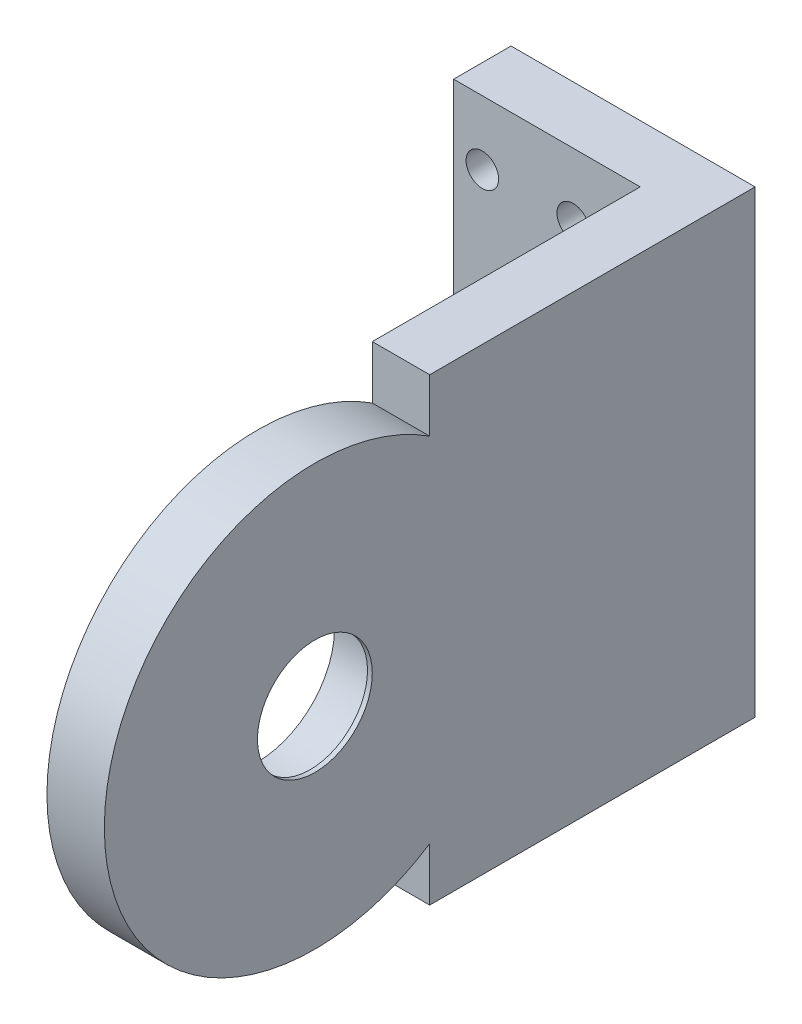
ISO-10303-21;
HEADER;
FILE_DESCRIPTION(('STEP AP214'),'2;1');
FILE_NAME('part.step','',(''),(''),'','','');
FILE_SCHEMA(('AUTOMOTIVE_DESIGN { 1 0 10303 214 1 1 1 1 }'));
ENDSEC;
DATA;
#1=APPLICATION_CONTEXT('core data for automotive mechanical design processes');
#2=APPLICATION_PROTOCOL_DEFINITION('international standard','automotive_design',2000,#1);
#3=PRODUCT_CONTEXT('',#1,'mechanical');
#4=PRODUCT('Part','Part','',(#3));
#5=PRODUCT_RELATED_PRODUCT_CATEGORY('part','',(#4));
#6=PRODUCT_DEFINITION_FORMATION('','',#4);
#7=PRODUCT_DEFINITION_CONTEXT('part definition',#1,'design');
#8=PRODUCT_DEFINITION('design','',#6,#7);
#9=PRODUCT_DEFINITION_SHAPE('','',#8);
#10=(LENGTH_UNIT() NAMED_UNIT(*) SI_UNIT(.MILLI.,.METRE.));
#11=(NAMED_UNIT(*) PLANE_ANGLE_UNIT() SI_UNIT($,.RADIAN.));
#12=(NAMED_UNIT(*) SI_UNIT($,.STERADIAN.) SOLID_ANGLE_UNIT());
#13=UNCERTAINTY_MEASURE_WITH_UNIT(LENGTH_MEASURE(1.E-05),#10,'distance_accuracy_value','');
#14=(GEOMETRIC_REPRESENTATION_CONTEXT(3) GLOBAL_UNCERTAINTY_ASSIGNED_CONTEXT((#13)) GLOBAL_UNIT_ASSIGNED_CONTEXT((#10,
#11,#12)) REPRESENTATION_CONTEXT('',''));
#15=CARTESIAN_POINT('',(0.,0.,0.));
#16=DIRECTION('',(0.,0.,1.));
#17=DIRECTION('',(1.,0.,0.));
#18=AXIS2_PLACEMENT_3D('',#15,#16,#17);
#19=CARTESIAN_POINT('',(342.5,300.,300.));
#20=DIRECTION('',(-1.,0.,0.));
#21=DIRECTION('',(0.,0.,1.));
#22=AXIS2_PLACEMENT_3D('',#19,#20,#21);
#23=CYLINDRICAL_SURFACE('',#22,22.);
#24=DIRECTION('',(-1.,0.,0.));
#25=VECTOR('',#24,1.);
#26=CARTESIAN_POINT('',(342.5,281.560911085414,288.));
#27=LINE('',#26,#25);
#28=CARTESIAN_POINT('',(342.5,281.560911085414,288.));
#29=VERTEX_POINT('',#28);
#30=CARTESIAN_POINT('',(336.5,281.560911085414,288.));
#31=VERTEX_POINT('',#30);
#32=EDGE_CURVE('E63',#29,#31,#27,.T.);
#33=ORIENTED_EDGE('',*,*,#32,.F.);
#34=CARTESIAN_POINT('',(342.5,300.,300.));
#35=DIRECTION('',(1.,0.,0.));
#36=DIRECTION('',(0.,0.,-1.));
#37=AXIS2_PLACEMENT_3D('',#34,#35,#36);
#38=CIRCLE('',#37,22.);
#39=CARTESIAN_POINT('',(342.5,318.439088914586,288.));
#40=VERTEX_POINT('',#39);
#41=EDGE_CURVE('E11',#40,#29,#38,.T.);
#42=ORIENTED_EDGE('',*,*,#41,.F.);
#43=DIRECTION('',(-1.,0.,0.));
#44=VECTOR('',#43,1.);
#45=CARTESIAN_POINT('',(342.5,318.439088914586,288.));
#46=LINE('',#45,#44);
#47=CARTESIAN_POINT('',(336.5,318.439088914586,288.));
#48=VERTEX_POINT('',#47);
#49=EDGE_CURVE('E169',#48,#40,#46,.F.);
#50=ORIENTED_EDGE('',*,*,#49,.F.);
#51=CARTESIAN_POINT('',(336.5,300.,300.));
#52=DIRECTION('',(1.,0.,0.));
#53=DIRECTION('',(0.,0.,-1.));
#54=AXIS2_PLACEMENT_3D('',#51,#52,#53);
#55=CIRCLE('',#54,22.);
#56=EDGE_CURVE('E47',#48,#31,#55,.T.);
#57=ORIENTED_EDGE('',*,*,#56,.T.);
#58=EDGE_LOOP('',(#33,#42,#50,#57));
#59=FACE_BOUND('',#58,.T.);
#60=ADVANCED_FACE('F39',(#59),#23,.T.);
#61=CARTESIAN_POINT('',(342.5,300.,300.));
#62=DIRECTION('',(1.,0.,0.));
#63=DIRECTION('',(0.,0.,-1.));
#64=AXIS2_PLACEMENT_3D('',#61,#62,#63);
#65=PLANE('',#64);
#66=CARTESIAN_POINT('',(342.5,300.,300.));
#67=DIRECTION('',(1.,0.,0.));
#68=DIRECTION('',(0.,0.,-1.));
#69=AXIS2_PLACEMENT_3D('',#66,#67,#68);
#70=CIRCLE('',#69,6.00000000000001);
#71=CARTESIAN_POINT('',(342.5,300.,294.));
#72=VERTEX_POINT('',#71);
#73=EDGE_CURVE('E139',#72,#72,#70,.T.);
#74=ORIENTED_EDGE('',*,*,#73,.F.);
#75=EDGE_LOOP('',(#74));
#76=FACE_BOUND('',#75,.T.);
#77=ORIENTED_EDGE('',*,*,#41,.T.);
#78=DIRECTION('',(0.,-1.,0.));
#79=VECTOR('',#78,1.);
#80=CARTESIAN_POINT('',(342.5,276.,288.));
#81=LINE('',#80,#79);
#82=CARTESIAN_POINT('',(342.5,276.,288.));
#83=VERTEX_POINT('',#82);
#84=EDGE_CURVE('E148',#29,#83,#81,.T.);
#85=ORIENTED_EDGE('',*,*,#84,.T.);
#86=DIRECTION('',(0.,0.,-1.));
#87=VECTOR('',#86,1.);
#88=CARTESIAN_POINT('',(342.5,276.,254.));
#89=LINE('',#88,#87);
#90=CARTESIAN_POINT('',(342.5,276.,254.));
#91=VERTEX_POINT('',#90);
#92=EDGE_CURVE('E152',#83,#91,#89,.T.);
#93=ORIENTED_EDGE('',*,*,#92,.T.);
#94=DIRECTION('',(0.,1.,0.));
#95=VECTOR('',#94,1.);
#96=CARTESIAN_POINT('',(342.5,324.,254.));
#97=LINE('',#96,#95);
#98=CARTESIAN_POINT('',(342.5,324.,254.));
#99=VERTEX_POINT('',#98);
#100=EDGE_CURVE('E143',#91,#99,#97,.T.);
#101=ORIENTED_EDGE('',*,*,#100,.T.);
#102=DIRECTION('',(0.,0.,1.));
#103=VECTOR('',#102,1.);
#104=CARTESIAN_POINT('',(342.5,324.,288.));
#105=LINE('',#104,#103);
#106=CARTESIAN_POINT('',(342.5,324.,288.));
#107=VERTEX_POINT('',#106);
#108=EDGE_CURVE('E146',#99,#107,#105,.T.);
#109=ORIENTED_EDGE('',*,*,#108,.T.);
#110=EDGE_CURVE('E149',#107,#40,#81,.T.);
#111=ORIENTED_EDGE('',*,*,#110,.T.);
#112=EDGE_LOOP('',(#77,#85,#93,#101,#109,#111));
#113=FACE_BOUND('',#112,.T.);
#114=ADVANCED_FACE('F188',(#76,#113),#65,.T.);
#115=CARTESIAN_POINT('',(336.5,300.,300.));
#116=DIRECTION('',(1.,0.,0.));
#117=DIRECTION('',(0.,0.,-1.));
#118=AXIS2_PLACEMENT_3D('',#115,#116,#117);
#119=PLANE('',#118);
#120=CARTESIAN_POINT('',(336.5,300.,300.));
#121=DIRECTION('',(1.,0.,0.));
#122=DIRECTION('',(0.,0.,-1.));
#123=AXIS2_PLACEMENT_3D('',#120,#121,#122);
#124=CIRCLE('',#123,8.05);
#125=CARTESIAN_POINT('',(336.5,300.,291.95));
#126=VERTEX_POINT('',#125);
#127=EDGE_CURVE('E129',#126,#126,#124,.T.);
#128=ORIENTED_EDGE('',*,*,#127,.T.);
#129=EDGE_LOOP('',(#128));
#130=FACE_BOUND('',#129,.T.);
#131=DIRECTION('',(0.,0.,1.));
#132=VECTOR('',#131,1.);
#133=CARTESIAN_POINT('',(336.5,324.,288.));
#134=LINE('',#133,#132);
#135=CARTESIAN_POINT('',(336.5,324.,260.));
#136=VERTEX_POINT('',#135);
#137=CARTESIAN_POINT('',(336.5,324.,288.));
#138=VERTEX_POINT('',#137);
#139=EDGE_CURVE('E142',#136,#138,#134,.T.);
#140=ORIENTED_EDGE('',*,*,#139,.F.);
#141=DIRECTION('',(0.,-1.,0.));
#142=VECTOR('',#141,1.);
#143=CARTESIAN_POINT('',(336.5,300.,260.));
#144=LINE('',#143,#142);
#145=CARTESIAN_POINT('',(336.5,276.,260.));
#146=VERTEX_POINT('',#145);
#147=EDGE_CURVE('E126',#136,#146,#144,.T.);
#148=ORIENTED_EDGE('',*,*,#147,.T.);
#149=DIRECTION('',(0.,0.,-1.));
#150=VECTOR('',#149,1.);
#151=CARTESIAN_POINT('',(336.5,276.,254.));
#152=LINE('',#151,#150);
#153=CARTESIAN_POINT('',(336.5,276.,288.));
#154=VERTEX_POINT('',#153);
#155=EDGE_CURVE('E113',#154,#146,#152,.T.);
#156=ORIENTED_EDGE('',*,*,#155,.F.);
#157=DIRECTION('',(0.,-1.,0.));
#158=VECTOR('',#157,1.);
#159=CARTESIAN_POINT('',(336.5,276.,288.));
#160=LINE('',#159,#158);
#161=EDGE_CURVE('E156',#31,#154,#160,.T.);
#162=ORIENTED_EDGE('',*,*,#161,.F.);
#163=ORIENTED_EDGE('',*,*,#56,.F.);
#164=EDGE_CURVE('E157',#138,#48,#160,.T.);
#165=ORIENTED_EDGE('',*,*,#164,.F.);
#166=EDGE_LOOP('',(#140,#148,#156,#162,#163,#165));
#167=FACE_BOUND('',#166,.T.);
#168=ADVANCED_FACE('F181',(#130,#167),#119,.F.);
#169=CARTESIAN_POINT('',(342.5,276.,288.));
#170=DIRECTION('',(0.,0.,-1.));
#171=DIRECTION('',(-1.,0.,0.));
#172=AXIS2_PLACEMENT_3D('',#169,#170,#171);
#173=PLANE('',#172);
#174=ORIENTED_EDGE('',*,*,#84,.F.);
#175=ORIENTED_EDGE('',*,*,#32,.T.);
#176=ORIENTED_EDGE('',*,*,#161,.T.);
#177=DIRECTION('',(-1.,0.,0.));
#178=VECTOR('',#177,1.);
#179=CARTESIAN_POINT('',(342.5,276.,288.));
#180=LINE('',#179,#178);
#181=EDGE_CURVE('E162',#83,#154,#180,.T.);
#182=ORIENTED_EDGE('',*,*,#181,.F.);
#183=EDGE_LOOP('',(#174,#175,#176,#182));
#184=FACE_BOUND('',#183,.T.);
#185=ADVANCED_FACE('F178',(#184),#173,.F.);
#186=ORIENTED_EDGE('',*,*,#164,.T.);
#187=ORIENTED_EDGE('',*,*,#49,.T.);
#188=ORIENTED_EDGE('',*,*,#110,.F.);
#189=DIRECTION('',(-1.,0.,0.));
#190=VECTOR('',#189,1.);
#191=CARTESIAN_POINT('',(342.5,324.,288.));
#192=LINE('',#191,#190);
#193=EDGE_CURVE('E164',#107,#138,#192,.T.);
#194=ORIENTED_EDGE('',*,*,#193,.T.);
#195=EDGE_LOOP('',(#186,#187,#188,#194));
#196=FACE_BOUND('',#195,.T.);
#197=ADVANCED_FACE('F186',(#196),#173,.F.);
#198=CARTESIAN_POINT('',(342.5,324.,254.));
#199=DIRECTION('',(0.,0.,1.));
#200=DIRECTION('',(1.,0.,0.));
#201=AXIS2_PLACEMENT_3D('',#198,#199,#200);
#202=PLANE('',#201);
#203=DIRECTION('',(0.,-1.,0.));
#204=VECTOR('',#203,1.);
#205=CARTESIAN_POINT('',(317.,324.,254.));
#206=LINE('',#205,#204);
#207=CARTESIAN_POINT('',(317.,324.,254.));
#208=VERTEX_POINT('',#207);
#209=CARTESIAN_POINT('',(317.,276.,254.));
#210=VERTEX_POINT('',#209);
#211=EDGE_CURVE('E122',#208,#210,#206,.T.);
#212=ORIENTED_EDGE('',*,*,#211,.F.);
#213=DIRECTION('',(-1.,0.,0.));
#214=VECTOR('',#213,1.);
#215=CARTESIAN_POINT('',(342.5,324.,254.));
#216=LINE('',#215,#214);
#217=EDGE_CURVE('E167',#99,#208,#216,.T.);
#218=ORIENTED_EDGE('',*,*,#217,.F.);
#219=ORIENTED_EDGE('',*,*,#100,.F.);
#220=DIRECTION('',(-1.,0.,0.));
#221=VECTOR('',#220,1.);
#222=CARTESIAN_POINT('',(342.5,276.,254.));
#223=LINE('',#222,#221);
#224=EDGE_CURVE('E154',#91,#210,#223,.T.);
#225=ORIENTED_EDGE('',*,*,#224,.T.);
#226=EDGE_LOOP('',(#212,#218,#219,#225));
#227=FACE_BOUND('',#226,.T.);
#228=CARTESIAN_POINT('',(320.,282.7,254.));
#229=DIRECTION('',(0.,0.,1.));
#230=DIRECTION('',(1.,0.,0.));
#231=AXIS2_PLACEMENT_3D('',#228,#229,#230);
#232=CIRCLE('',#231,1.69999999999998);
#233=CARTESIAN_POINT('',(321.7,282.7,254.));
#234=VERTEX_POINT('',#233);
#235=EDGE_CURVE('E196',#234,#234,#232,.T.);
#236=ORIENTED_EDGE('',*,*,#235,.T.);
#237=EDGE_LOOP('',(#236));
#238=FACE_BOUND('',#237,.T.);
#239=CARTESIAN_POINT('',(320.,317.3,254.));
#240=DIRECTION('',(0.,0.,1.));
#241=DIRECTION('',(1.,0.,0.));
#242=AXIS2_PLACEMENT_3D('',#239,#240,#241);
#243=CIRCLE('',#242,1.69999999999998);
#244=CARTESIAN_POINT('',(321.7,317.3,254.));
#245=VERTEX_POINT('',#244);
#246=EDGE_CURVE('E203',#245,#245,#243,.T.);
#247=ORIENTED_EDGE('',*,*,#246,.T.);
#248=EDGE_LOOP('',(#247));
#249=FACE_BOUND('',#248,.T.);
#250=CARTESIAN_POINT('',(329.5,282.7,254.));
#251=DIRECTION('',(0.,0.,1.));
#252=DIRECTION('',(1.,0.,0.));
#253=AXIS2_PLACEMENT_3D('',#250,#251,#252);
#254=CIRCLE('',#253,1.69999999999998);
#255=CARTESIAN_POINT('',(331.2,282.7,254.));
#256=VERTEX_POINT('',#255);
#257=EDGE_CURVE('E209',#256,#256,#254,.T.);
#258=ORIENTED_EDGE('',*,*,#257,.T.);
#259=EDGE_LOOP('',(#258));
#260=FACE_BOUND('',#259,.T.);
#261=CARTESIAN_POINT('',(329.5,317.3,254.));
#262=DIRECTION('',(0.,0.,1.));
#263=DIRECTION('',(1.,0.,0.));
#264=AXIS2_PLACEMENT_3D('',#261,#262,#263);
#265=CIRCLE('',#264,1.69999999999998);
#266=CARTESIAN_POINT('',(331.2,317.3,254.));
#267=VERTEX_POINT('',#266);
#268=EDGE_CURVE('E215',#267,#267,#265,.T.);
#269=ORIENTED_EDGE('',*,*,#268,.T.);
#270=EDGE_LOOP('',(#269));
#271=FACE_BOUND('',#270,.T.);
#272=ADVANCED_FACE('F192',(#227,#238,#249,#260,#271),#202,.F.);
#273=CARTESIAN_POINT('',(342.5,324.,288.));
#274=DIRECTION('',(0.,-1.,0.));
#275=DIRECTION('',(0.,0.,-1.));
#276=AXIS2_PLACEMENT_3D('',#273,#274,#275);
#277=PLANE('',#276);
#278=ORIENTED_EDGE('',*,*,#217,.T.);
#279=DIRECTION('',(0.,0.,-1.));
#280=VECTOR('',#279,1.);
#281=CARTESIAN_POINT('',(317.,324.,260.));
#282=LINE('',#281,#280);
#283=CARTESIAN_POINT('',(317.,324.,260.));
#284=VERTEX_POINT('',#283);
#285=EDGE_CURVE('E127',#284,#208,#282,.T.);
#286=ORIENTED_EDGE('',*,*,#285,.F.);
#287=DIRECTION('',(-1.,0.,0.));
#288=VECTOR('',#287,1.);
#289=CARTESIAN_POINT('',(336.51,324.,260.));
#290=LINE('',#289,#288);
#291=EDGE_CURVE('E55',#136,#284,#290,.T.);
#292=ORIENTED_EDGE('',*,*,#291,.F.);
#293=ORIENTED_EDGE('',*,*,#139,.T.);
#294=ORIENTED_EDGE('',*,*,#193,.F.);
#295=ORIENTED_EDGE('',*,*,#108,.F.);
#296=EDGE_LOOP('',(#278,#286,#292,#293,#294,#295));
#297=FACE_BOUND('',#296,.T.);
#298=ADVANCED_FACE('F183',(#297),#277,.F.);
#299=CARTESIAN_POINT('',(342.5,276.,254.));
#300=DIRECTION('',(0.,1.,0.));
#301=DIRECTION('',(0.,0.,1.));
#302=AXIS2_PLACEMENT_3D('',#299,#300,#301);
#303=PLANE('',#302);
#304=ORIENTED_EDGE('',*,*,#155,.T.);
#305=DIRECTION('',(1.,0.,0.));
#306=VECTOR('',#305,1.);
#307=CARTESIAN_POINT('',(317.,276.,260.));
#308=LINE('',#307,#306);
#309=CARTESIAN_POINT('',(317.,276.,260.));
#310=VERTEX_POINT('',#309);
#311=EDGE_CURVE('E104',#310,#146,#308,.T.);
#312=ORIENTED_EDGE('',*,*,#311,.F.);
#313=DIRECTION('',(0.,0.,-1.));
#314=VECTOR('',#313,1.);
#315=CARTESIAN_POINT('',(317.,276.,260.));
#316=LINE('',#315,#314);
#317=EDGE_CURVE('E109',#310,#210,#316,.T.);
#318=ORIENTED_EDGE('',*,*,#317,.T.);
#319=ORIENTED_EDGE('',*,*,#224,.F.);
#320=ORIENTED_EDGE('',*,*,#92,.F.);
#321=ORIENTED_EDGE('',*,*,#181,.T.);
#322=EDGE_LOOP('',(#304,#312,#318,#319,#320,#321));
#323=FACE_BOUND('',#322,.T.);
#324=ADVANCED_FACE('F106',(#323),#303,.F.);
#325=CARTESIAN_POINT('',(342.5,300.,300.));
#326=DIRECTION('',(-1.,0.,0.));
#327=DIRECTION('',(0.,0.,1.));
#328=AXIS2_PLACEMENT_3D('',#325,#326,#327);
#329=CYLINDRICAL_SURFACE('',#328,6.00000000000001);
#330=CARTESIAN_POINT('',(342.,300.,300.));
#331=DIRECTION('',(1.,0.,0.));
#332=DIRECTION('',(0.,0.,-1.));
#333=AXIS2_PLACEMENT_3D('',#330,#331,#332);
#334=CIRCLE('',#333,6.00000000000001);
#335=CARTESIAN_POINT('',(342.,300.,294.));
#336=VERTEX_POINT('',#335);
#337=EDGE_CURVE('E42',#336,#336,#334,.T.);
#338=ORIENTED_EDGE('',*,*,#337,.F.);
#339=EDGE_LOOP('',(#338));
#340=FACE_BOUND('',#339,.T.);
#341=ORIENTED_EDGE('',*,*,#73,.T.);
#342=EDGE_LOOP('',(#341));
#343=FACE_BOUND('',#342,.T.);
#344=ADVANCED_FACE('F269',(#340,#343),#329,.F.);
#345=CARTESIAN_POINT('',(342.,300.,300.));
#346=DIRECTION('',(-1.,0.,0.));
#347=DIRECTION('',(0.,0.,1.));
#348=AXIS2_PLACEMENT_3D('',#345,#346,#347);
#349=CYLINDRICAL_SURFACE('',#348,8.05);
#350=CARTESIAN_POINT('',(342.,300.,300.));
#351=DIRECTION('',(1.,0.,0.));
#352=DIRECTION('',(0.,0.,-1.));
#353=AXIS2_PLACEMENT_3D('',#350,#351,#352);
#354=CIRCLE('',#353,8.05);
#355=CARTESIAN_POINT('',(342.,300.,291.95));
#356=VERTEX_POINT('',#355);
#357=EDGE_CURVE('E134',#356,#356,#354,.T.);
#358=ORIENTED_EDGE('',*,*,#357,.T.);
#359=EDGE_LOOP('',(#358));
#360=FACE_BOUND('',#359,.T.);
#361=ORIENTED_EDGE('',*,*,#127,.F.);
#362=EDGE_LOOP('',(#361));
#363=FACE_BOUND('',#362,.T.);
#364=ADVANCED_FACE('F271',(#360,#363),#349,.F.);
#365=CARTESIAN_POINT('',(342.,300.,300.));
#366=DIRECTION('',(1.,0.,0.));
#367=DIRECTION('',(0.,0.,-1.));
#368=AXIS2_PLACEMENT_3D('',#365,#366,#367);
#369=PLANE('',#368);
#370=ORIENTED_EDGE('',*,*,#337,.T.);
#371=EDGE_LOOP('',(#370));
#372=FACE_BOUND('',#371,.T.);
#373=ORIENTED_EDGE('',*,*,#357,.F.);
#374=EDGE_LOOP('',(#373));
#375=FACE_BOUND('',#374,.T.);
#376=ADVANCED_FACE('F226',(#372,#375),#369,.F.);
#377=CARTESIAN_POINT('',(0.,0.,260.));
#378=DIRECTION('',(0.,0.,1.));
#379=DIRECTION('',(1.,0.,0.));
#380=AXIS2_PLACEMENT_3D('',#377,#378,#379);
#381=PLANE('',#380);
#382=CARTESIAN_POINT('',(329.5,317.3,260.));
#383=DIRECTION('',(0.,0.,1.));
#384=DIRECTION('',(1.,0.,0.));
#385=AXIS2_PLACEMENT_3D('',#382,#383,#384);
#386=CIRCLE('',#385,1.69999999999998);
#387=CARTESIAN_POINT('',(331.2,317.3,260.));
#388=VERTEX_POINT('',#387);
#389=EDGE_CURVE('E212',#388,#388,#386,.T.);
#390=ORIENTED_EDGE('',*,*,#389,.F.);
#391=EDGE_LOOP('',(#390));
#392=FACE_BOUND('',#391,.T.);
#393=CARTESIAN_POINT('',(320.,317.3,260.));
#394=DIRECTION('',(0.,0.,1.));
#395=DIRECTION('',(1.,0.,0.));
#396=AXIS2_PLACEMENT_3D('',#393,#394,#395);
#397=CIRCLE('',#396,1.69999999999998);
#398=CARTESIAN_POINT('',(321.7,317.3,260.));
#399=VERTEX_POINT('',#398);
#400=EDGE_CURVE('E201',#399,#399,#397,.T.);
#401=ORIENTED_EDGE('',*,*,#400,.F.);
#402=EDGE_LOOP('',(#401));
#403=FACE_BOUND('',#402,.T.);
#404=CARTESIAN_POINT('',(320.,282.7,260.));
#405=DIRECTION('',(0.,0.,1.));
#406=DIRECTION('',(1.,0.,0.));
#407=AXIS2_PLACEMENT_3D('',#404,#405,#406);
#408=CIRCLE('',#407,1.69999999999998);
#409=CARTESIAN_POINT('',(321.7,282.7,260.));
#410=VERTEX_POINT('',#409);
#411=EDGE_CURVE('E194',#410,#410,#408,.T.);
#412=ORIENTED_EDGE('',*,*,#411,.F.);
#413=EDGE_LOOP('',(#412));
#414=FACE_BOUND('',#413,.T.);
#415=CARTESIAN_POINT('',(329.5,282.7,260.));
#416=DIRECTION('',(0.,0.,1.));
#417=DIRECTION('',(1.,0.,0.));
#418=AXIS2_PLACEMENT_3D('',#415,#416,#417);
#419=CIRCLE('',#418,1.69999999999998);
#420=CARTESIAN_POINT('',(331.2,282.7,260.));
#421=VERTEX_POINT('',#420);
#422=EDGE_CURVE('E206',#421,#421,#419,.T.);
#423=ORIENTED_EDGE('',*,*,#422,.F.);
#424=EDGE_LOOP('',(#423));
#425=FACE_BOUND('',#424,.T.);
#426=ORIENTED_EDGE('',*,*,#147,.F.);
#427=ORIENTED_EDGE('',*,*,#291,.T.);
#428=DIRECTION('',(0.,-1.,0.));
#429=VECTOR('',#428,1.);
#430=CARTESIAN_POINT('',(317.,324.,260.));
#431=LINE('',#430,#429);
#432=EDGE_CURVE('E116',#284,#310,#431,.T.);
#433=ORIENTED_EDGE('',*,*,#432,.T.);
#434=ORIENTED_EDGE('',*,*,#311,.T.);
#435=EDGE_LOOP('',(#426,#427,#433,#434));
#436=FACE_BOUND('',#435,.T.);
#437=ADVANCED_FACE('F119',(#392,#403,#414,#425,#436),#381,.T.);
#438=CARTESIAN_POINT('',(317.,324.,260.));
#439=DIRECTION('',(1.,0.,0.));
#440=DIRECTION('',(0.,0.,-1.));
#441=AXIS2_PLACEMENT_3D('',#438,#439,#440);
#442=PLANE('',#441);
#443=ORIENTED_EDGE('',*,*,#211,.T.);
#444=ORIENTED_EDGE('',*,*,#317,.F.);
#445=ORIENTED_EDGE('',*,*,#432,.F.);
#446=ORIENTED_EDGE('',*,*,#285,.T.);
#447=EDGE_LOOP('',(#443,#444,#445,#446));
#448=FACE_BOUND('',#447,.T.);
#449=ADVANCED_FACE('F124',(#448),#442,.F.);
#450=CARTESIAN_POINT('',(320.,282.7,260.));
#451=DIRECTION('',(0.,0.,-1.));
#452=DIRECTION('',(-1.,0.,0.));
#453=AXIS2_PLACEMENT_3D('',#450,#451,#452);
#454=CYLINDRICAL_SURFACE('',#453,1.69999999999998);
#455=ORIENTED_EDGE('',*,*,#411,.T.);
#456=EDGE_LOOP('',(#455));
#457=FACE_BOUND('',#456,.T.);
#458=ORIENTED_EDGE('',*,*,#235,.F.);
#459=EDGE_LOOP('',(#458));
#460=FACE_BOUND('',#459,.T.);
#461=ADVANCED_FACE('F280',(#457,#460),#454,.F.);
#462=CARTESIAN_POINT('',(320.,317.3,260.));
#463=DIRECTION('',(0.,0.,-1.));
#464=DIRECTION('',(-1.,0.,0.));
#465=AXIS2_PLACEMENT_3D('',#462,#463,#464);
#466=CYLINDRICAL_SURFACE('',#465,1.69999999999998);
#467=ORIENTED_EDGE('',*,*,#400,.T.);
#468=EDGE_LOOP('',(#467));
#469=FACE_BOUND('',#468,.T.);
#470=ORIENTED_EDGE('',*,*,#246,.F.);
#471=EDGE_LOOP('',(#470));
#472=FACE_BOUND('',#471,.T.);
#473=ADVANCED_FACE('F237',(#469,#472),#466,.F.);
#474=CARTESIAN_POINT('',(329.5,282.7,260.));
#475=DIRECTION('',(0.,0.,-1.));
#476=DIRECTION('',(-1.,0.,0.));
#477=AXIS2_PLACEMENT_3D('',#474,#475,#476);
#478=CYLINDRICAL_SURFACE('',#477,1.69999999999998);
#479=ORIENTED_EDGE('',*,*,#422,.T.);
#480=EDGE_LOOP('',(#479));
#481=FACE_BOUND('',#480,.T.);
#482=ORIENTED_EDGE('',*,*,#257,.F.);
#483=EDGE_LOOP('',(#482));
#484=FACE_BOUND('',#483,.T.);
#485=ADVANCED_FACE('F234',(#481,#484),#478,.F.);
#486=CARTESIAN_POINT('',(329.5,317.3,260.));
#487=DIRECTION('',(0.,0.,-1.));
#488=DIRECTION('',(-1.,0.,0.));
#489=AXIS2_PLACEMENT_3D('',#486,#487,#488);
#490=CYLINDRICAL_SURFACE('',#489,1.69999999999998);
#491=ORIENTED_EDGE('',*,*,#389,.T.);
#492=EDGE_LOOP('',(#491));
#493=FACE_BOUND('',#492,.T.);
#494=ORIENTED_EDGE('',*,*,#268,.F.);
#495=EDGE_LOOP('',(#494));
#496=FACE_BOUND('',#495,.T.);
#497=ADVANCED_FACE('F221',(#493,#496),#490,.F.);
#498=CLOSED_SHELL('',(#60,#114,#168,#185,#197,#272,#298,#324,#344,#364,#376,#437,#449,#461,#473,
#485,#497));
#499=MANIFOLD_SOLID_BREP('B2',#498);
#500=ADVANCED_BREP_SHAPE_REPRESENTATION('',(#18,#499),#14);
#501=SHAPE_DEFINITION_REPRESENTATION(#9,#500);
ENDSEC;
END-ISO-10303-21;
